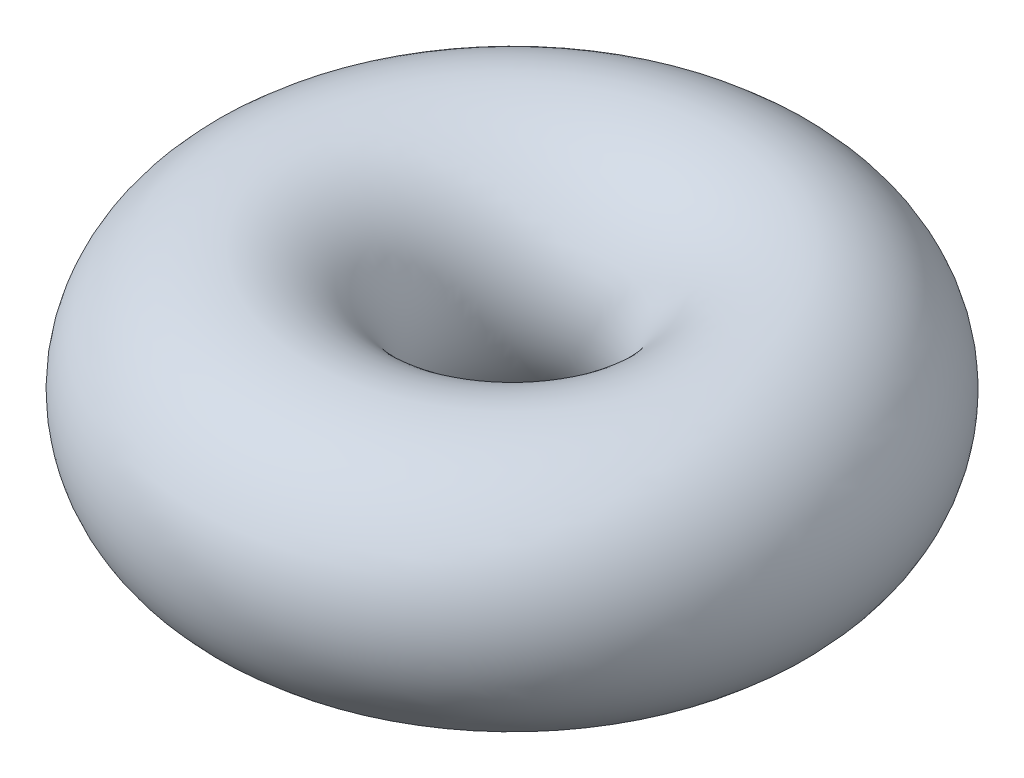
ISO-10303-21;
HEADER;
FILE_DESCRIPTION(('STEP AP214'),'2;1');
FILE_NAME('part.step','',(''),(''),'','','');
FILE_SCHEMA(('AUTOMOTIVE_DESIGN { 1 0 10303 214 1 1 1 1 }'));
ENDSEC;
DATA;
#1=APPLICATION_CONTEXT('core data for automotive mechanical design processes');
#2=APPLICATION_PROTOCOL_DEFINITION('international standard','automotive_design',2000,#1);
#3=PRODUCT_CONTEXT('',#1,'mechanical');
#4=PRODUCT('Part','Part','',(#3));
#5=PRODUCT_RELATED_PRODUCT_CATEGORY('part','',(#4));
#6=PRODUCT_DEFINITION_FORMATION('','',#4);
#7=PRODUCT_DEFINITION_CONTEXT('part definition',#1,'design');
#8=PRODUCT_DEFINITION('design','',#6,#7);
#9=PRODUCT_DEFINITION_SHAPE('','',#8);
#10=(LENGTH_UNIT() NAMED_UNIT(*) SI_UNIT(.MILLI.,.METRE.));
#11=(NAMED_UNIT(*) PLANE_ANGLE_UNIT() SI_UNIT($,.RADIAN.));
#12=(NAMED_UNIT(*) SI_UNIT($,.STERADIAN.) SOLID_ANGLE_UNIT());
#13=UNCERTAINTY_MEASURE_WITH_UNIT(LENGTH_MEASURE(1.E-05),#10,'distance_accuracy_value','');
#14=(GEOMETRIC_REPRESENTATION_CONTEXT(3) GLOBAL_UNCERTAINTY_ASSIGNED_CONTEXT((#13)) GLOBAL_UNIT_ASSIGNED_CONTEXT((#10,
#11,#12)) REPRESENTATION_CONTEXT('',''));
#15=CARTESIAN_POINT('',(0.,0.,0.));
#16=DIRECTION('',(0.,0.,1.));
#17=DIRECTION('',(1.,0.,0.));
#18=AXIS2_PLACEMENT_3D('',#15,#16,#17);
#19=CARTESIAN_POINT('',(0.,0.,0.));
#20=DIRECTION('',(0.,1.,0.));
#21=DIRECTION('',(-1.,0.,0.));
#22=AXIS2_PLACEMENT_3D('',#19,#20,#21);
#23=TOROIDAL_SURFACE('',#22,2.5,1.5);
#24=CARTESIAN_POINT('',(-4.,0.,0.));
#25=VERTEX_POINT('',#24);
#26=VERTEX_LOOP('',#25);
#27=FACE_BOUND('',#26,.T.);
#28=ADVANCED_FACE('F28',(#27),#23,.T.);
#29=CLOSED_SHELL('',(#28));
#30=MANIFOLD_SOLID_BREP('B2',#29);
#31=ADVANCED_BREP_SHAPE_REPRESENTATION('',(#18,#30),#14);
#32=SHAPE_DEFINITION_REPRESENTATION(#9,#31);
ENDSEC;
END-ISO-10303-21;
